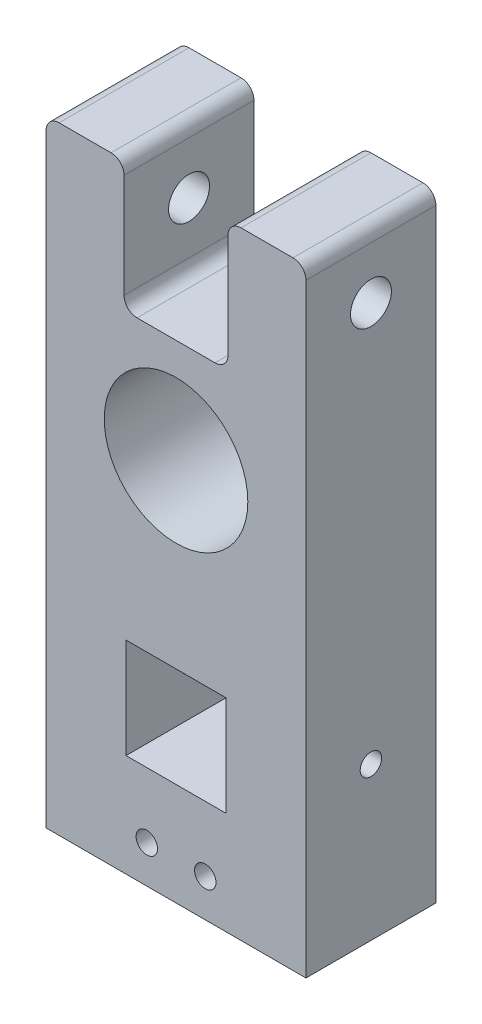
ISO-10303-21;
HEADER;
FILE_DESCRIPTION(('STEP AP214'),'2;1');
FILE_NAME('part.step','',(''),(''),'','','');
FILE_SCHEMA(('AUTOMOTIVE_DESIGN { 1 0 10303 214 1 1 1 1 }'));
ENDSEC;
DATA;
#1=APPLICATION_CONTEXT('core data for automotive mechanical design processes');
#2=APPLICATION_PROTOCOL_DEFINITION('international standard','automotive_design',2000,#1);
#3=PRODUCT_CONTEXT('',#1,'mechanical');
#4=PRODUCT('Part','Part','',(#3));
#5=PRODUCT_RELATED_PRODUCT_CATEGORY('part','',(#4));
#6=PRODUCT_DEFINITION_FORMATION('','',#4);
#7=PRODUCT_DEFINITION_CONTEXT('part definition',#1,'design');
#8=PRODUCT_DEFINITION('design','',#6,#7);
#9=PRODUCT_DEFINITION_SHAPE('','',#8);
#10=(LENGTH_UNIT() NAMED_UNIT(*) SI_UNIT(.MILLI.,.METRE.));
#11=(NAMED_UNIT(*) PLANE_ANGLE_UNIT() SI_UNIT($,.RADIAN.));
#12=(NAMED_UNIT(*) SI_UNIT($,.STERADIAN.) SOLID_ANGLE_UNIT());
#13=UNCERTAINTY_MEASURE_WITH_UNIT(LENGTH_MEASURE(1.E-05),#10,'distance_accuracy_value','');
#14=(GEOMETRIC_REPRESENTATION_CONTEXT(3) GLOBAL_UNCERTAINTY_ASSIGNED_CONTEXT((#13)) GLOBAL_UNIT_ASSIGNED_CONTEXT((#10,
#11,#12)) REPRESENTATION_CONTEXT('',''));
#15=CARTESIAN_POINT('',(0.,0.,0.));
#16=DIRECTION('',(0.,0.,1.));
#17=DIRECTION('',(1.,0.,0.));
#18=AXIS2_PLACEMENT_3D('',#15,#16,#17);
#19=CARTESIAN_POINT('',(-20.,46.55,20.));
#20=DIRECTION('',(0.,-1.,0.));
#21=DIRECTION('',(0.,0.,-1.));
#22=AXIS2_PLACEMENT_3D('',#19,#20,#21);
#23=PLANE('',#22);
#24=DIRECTION('',(-1.,0.,0.));
#25=VECTOR('',#24,1.);
#26=CARTESIAN_POINT('',(-20.,46.55,0.));
#27=LINE('',#26,#25);
#28=CARTESIAN_POINT('',(18.,46.55,0.));
#29=VERTEX_POINT('',#28);
#30=CARTESIAN_POINT('',(10.,46.55,0.));
#31=VERTEX_POINT('',#30);
#32=EDGE_CURVE('E288',#29,#31,#27,.T.);
#33=ORIENTED_EDGE('',*,*,#32,.T.);
#34=DIRECTION('',(0.,0.,1.));
#35=VECTOR('',#34,1.);
#36=CARTESIAN_POINT('',(10.,46.55,20.));
#37=LINE('',#36,#35);
#38=CARTESIAN_POINT('',(10.,46.55,20.));
#39=VERTEX_POINT('',#38);
#40=EDGE_CURVE('E321',#31,#39,#37,.T.);
#41=ORIENTED_EDGE('',*,*,#40,.T.);
#42=DIRECTION('',(-1.,0.,0.));
#43=VECTOR('',#42,1.);
#44=CARTESIAN_POINT('',(-20.,46.55,20.));
#45=LINE('',#44,#43);
#46=CARTESIAN_POINT('',(18.,46.55,20.));
#47=VERTEX_POINT('',#46);
#48=EDGE_CURVE('E271',#47,#39,#45,.T.);
#49=ORIENTED_EDGE('',*,*,#48,.F.);
#50=DIRECTION('',(0.,0.,-1.));
#51=VECTOR('',#50,1.);
#52=CARTESIAN_POINT('',(18.,46.55,20.));
#53=LINE('',#52,#51);
#54=EDGE_CURVE('E313',#47,#29,#53,.T.);
#55=ORIENTED_EDGE('',*,*,#54,.T.);
#56=EDGE_LOOP('',(#33,#41,#49,#55));
#57=FACE_BOUND('',#56,.T.);
#58=ADVANCED_FACE('F42',(#57),#23,.F.);
#59=CARTESIAN_POINT('',(0.,0.,20.));
#60=DIRECTION('',(0.,0.,-1.));
#61=DIRECTION('',(-1.,0.,0.));
#62=AXIS2_PLACEMENT_3D('',#59,#60,#61);
#63=PLANE('',#62);
#64=CARTESIAN_POINT('',(-4.50000000000001,-42.65,20.));
#65=DIRECTION('',(0.,0.,-1.));
#66=DIRECTION('',(-1.,0.,0.));
#67=AXIS2_PLACEMENT_3D('',#64,#65,#66);
#68=CIRCLE('',#67,1.65);
#69=CARTESIAN_POINT('',(-6.15000000000001,-42.65,20.));
#70=VERTEX_POINT('',#69);
#71=EDGE_CURVE('E218',#70,#70,#68,.T.);
#72=ORIENTED_EDGE('',*,*,#71,.T.);
#73=EDGE_LOOP('',(#72));
#74=FACE_BOUND('',#73,.T.);
#75=CARTESIAN_POINT('',(4.49999999999999,-42.65,20.));
#76=DIRECTION('',(0.,0.,-1.));
#77=DIRECTION('',(-1.,0.,0.));
#78=AXIS2_PLACEMENT_3D('',#75,#76,#77);
#79=CIRCLE('',#78,1.65);
#80=CARTESIAN_POINT('',(2.84999999999999,-42.65,20.));
#81=VERTEX_POINT('',#80);
#82=EDGE_CURVE('E207',#81,#81,#79,.T.);
#83=ORIENTED_EDGE('',*,*,#82,.T.);
#84=EDGE_LOOP('',(#83));
#85=FACE_BOUND('',#84,.T.);
#86=DIRECTION('',(-1.,0.,0.));
#87=VECTOR('',#86,1.);
#88=CARTESIAN_POINT('',(7.7,-32.65,20.));
#89=LINE('',#88,#87);
#90=CARTESIAN_POINT('',(7.7,-32.65,20.));
#91=VERTEX_POINT('',#90);
#92=CARTESIAN_POINT('',(-7.7,-32.65,20.));
#93=VERTEX_POINT('',#92);
#94=EDGE_CURVE('E183',#91,#93,#89,.T.);
#95=ORIENTED_EDGE('',*,*,#94,.T.);
#96=DIRECTION('',(0.,1.,0.));
#97=VECTOR('',#96,1.);
#98=CARTESIAN_POINT('',(-7.7,-32.65,20.));
#99=LINE('',#98,#97);
#100=CARTESIAN_POINT('',(-7.7,-17.25,20.));
#101=VERTEX_POINT('',#100);
#102=EDGE_CURVE('E174',#93,#101,#99,.T.);
#103=ORIENTED_EDGE('',*,*,#102,.T.);
#104=DIRECTION('',(1.,0.,0.));
#105=VECTOR('',#104,1.);
#106=CARTESIAN_POINT('',(7.7,-17.25,20.));
#107=LINE('',#106,#105);
#108=CARTESIAN_POINT('',(7.7,-17.25,20.));
#109=VERTEX_POINT('',#108);
#110=EDGE_CURVE('E189',#101,#109,#107,.T.);
#111=ORIENTED_EDGE('',*,*,#110,.T.);
#112=DIRECTION('',(0.,-1.,0.));
#113=VECTOR('',#112,1.);
#114=CARTESIAN_POINT('',(7.7,-32.65,20.));
#115=LINE('',#114,#113);
#116=EDGE_CURVE('E194',#109,#91,#115,.T.);
#117=ORIENTED_EDGE('',*,*,#116,.T.);
#118=EDGE_LOOP('',(#95,#103,#111,#117));
#119=FACE_BOUND('',#118,.T.);
#120=CARTESIAN_POINT('',(0.,10.55,20.));
#121=DIRECTION('',(0.,0.,1.));
#122=DIRECTION('',(1.,0.,0.));
#123=AXIS2_PLACEMENT_3D('',#120,#121,#122);
#124=CIRCLE('',#123,11.05);
#125=CARTESIAN_POINT('',(11.05,10.55,20.));
#126=VERTEX_POINT('',#125);
#127=EDGE_CURVE('E225',#126,#126,#124,.T.);
#128=ORIENTED_EDGE('',*,*,#127,.F.);
#129=EDGE_LOOP('',(#128));
#130=FACE_BOUND('',#129,.T.);
#131=ORIENTED_EDGE('',*,*,#48,.T.);
#132=CARTESIAN_POINT('',(10.,44.55,20.));
#133=DIRECTION('',(0.,0.,-1.));
#134=DIRECTION('',(-1.,0.,0.));
#135=AXIS2_PLACEMENT_3D('',#132,#133,#134);
#136=CIRCLE('',#135,2.);
#137=CARTESIAN_POINT('',(8.,44.55,20.));
#138=VERTEX_POINT('',#137);
#139=EDGE_CURVE('E340',#39,#138,#136,.F.);
#140=ORIENTED_EDGE('',*,*,#139,.T.);
#141=DIRECTION('',(0.,1.,0.));
#142=VECTOR('',#141,1.);
#143=CARTESIAN_POINT('',(8.,26.55,20.));
#144=LINE('',#143,#142);
#145=CARTESIAN_POINT('',(8.,28.55,20.));
#146=VERTEX_POINT('',#145);
#147=EDGE_CURVE('E232',#146,#138,#144,.T.);
#148=ORIENTED_EDGE('',*,*,#147,.F.);
#149=CARTESIAN_POINT('',(6.,28.55,20.));
#150=DIRECTION('',(0.,0.,-1.));
#151=DIRECTION('',(-1.,0.,0.));
#152=AXIS2_PLACEMENT_3D('',#149,#150,#151);
#153=CIRCLE('',#152,2.);
#154=CARTESIAN_POINT('',(6.,26.55,20.));
#155=VERTEX_POINT('',#154);
#156=EDGE_CURVE('E52',#146,#155,#153,.T.);
#157=ORIENTED_EDGE('',*,*,#156,.T.);
#158=DIRECTION('',(1.,0.,0.));
#159=VECTOR('',#158,1.);
#160=CARTESIAN_POINT('',(-8.,26.55,20.));
#161=LINE('',#160,#159);
#162=CARTESIAN_POINT('',(-6.,26.55,20.));
#163=VERTEX_POINT('',#162);
#164=EDGE_CURVE('E246',#163,#155,#161,.T.);
#165=ORIENTED_EDGE('',*,*,#164,.F.);
#166=CARTESIAN_POINT('',(-6.,28.55,20.));
#167=DIRECTION('',(0.,0.,-1.));
#168=DIRECTION('',(-1.,0.,0.));
#169=AXIS2_PLACEMENT_3D('',#166,#167,#168);
#170=CIRCLE('',#169,2.);
#171=CARTESIAN_POINT('',(-8.,28.55,20.));
#172=VERTEX_POINT('',#171);
#173=EDGE_CURVE('E383',#163,#172,#170,.T.);
#174=ORIENTED_EDGE('',*,*,#173,.T.);
#175=DIRECTION('',(0.,-1.,0.));
#176=VECTOR('',#175,1.);
#177=CARTESIAN_POINT('',(-8.,26.55,20.));
#178=LINE('',#177,#176);
#179=CARTESIAN_POINT('',(-8.,44.55,20.));
#180=VERTEX_POINT('',#179);
#181=EDGE_CURVE('E245',#180,#172,#178,.T.);
#182=ORIENTED_EDGE('',*,*,#181,.F.);
#183=CARTESIAN_POINT('',(-10.,44.55,20.));
#184=DIRECTION('',(0.,0.,-1.));
#185=DIRECTION('',(-1.,0.,0.));
#186=AXIS2_PLACEMENT_3D('',#183,#184,#185);
#187=CIRCLE('',#186,2.);
#188=CARTESIAN_POINT('',(-10.,46.55,20.));
#189=VERTEX_POINT('',#188);
#190=EDGE_CURVE('E332',#180,#189,#187,.F.);
#191=ORIENTED_EDGE('',*,*,#190,.T.);
#192=CARTESIAN_POINT('',(-18.,46.55,20.));
#193=VERTEX_POINT('',#192);
#194=EDGE_CURVE('E269',#189,#193,#45,.T.);
#195=ORIENTED_EDGE('',*,*,#194,.T.);
#196=CARTESIAN_POINT('',(-18.,44.55,20.));
#197=DIRECTION('',(0.,0.,-1.));
#198=DIRECTION('',(-1.,0.,0.));
#199=AXIS2_PLACEMENT_3D('',#196,#197,#198);
#200=CIRCLE('',#199,2.);
#201=CARTESIAN_POINT('',(-20.,44.55,20.));
#202=VERTEX_POINT('',#201);
#203=EDGE_CURVE('E331',#193,#202,#200,.F.);
#204=ORIENTED_EDGE('',*,*,#203,.T.);
#205=DIRECTION('',(0.,-1.,0.));
#206=VECTOR('',#205,1.);
#207=CARTESIAN_POINT('',(-20.,-48.45,20.));
#208=LINE('',#207,#206);
#209=CARTESIAN_POINT('',(-20.,-48.45,20.));
#210=VERTEX_POINT('',#209);
#211=EDGE_CURVE('E274',#202,#210,#208,.T.);
#212=ORIENTED_EDGE('',*,*,#211,.T.);
#213=DIRECTION('',(1.,0.,0.));
#214=VECTOR('',#213,1.);
#215=CARTESIAN_POINT('',(-20.,-48.45,20.));
#216=LINE('',#215,#214);
#217=CARTESIAN_POINT('',(20.,-48.45,20.));
#218=VERTEX_POINT('',#217);
#219=EDGE_CURVE('E280',#210,#218,#216,.T.);
#220=ORIENTED_EDGE('',*,*,#219,.T.);
#221=DIRECTION('',(0.,1.,0.));
#222=VECTOR('',#221,1.);
#223=CARTESIAN_POINT('',(20.,-48.45,20.));
#224=LINE('',#223,#222);
#225=CARTESIAN_POINT('',(20.,44.55,20.));
#226=VERTEX_POINT('',#225);
#227=EDGE_CURVE('E261',#218,#226,#224,.T.);
#228=ORIENTED_EDGE('',*,*,#227,.T.);
#229=CARTESIAN_POINT('',(18.,44.55,20.));
#230=DIRECTION('',(0.,0.,-1.));
#231=DIRECTION('',(-1.,0.,0.));
#232=AXIS2_PLACEMENT_3D('',#229,#230,#231);
#233=CIRCLE('',#232,2.);
#234=EDGE_CURVE('E330',#226,#47,#233,.F.);
#235=ORIENTED_EDGE('',*,*,#234,.T.);
#236=EDGE_LOOP('',(#131,#140,#148,#157,#165,#174,#182,#191,#195,#204,#212,#220,#228,#235));
#237=FACE_BOUND('',#236,.T.);
#238=ADVANCED_FACE('F193',(#74,#85,#119,#130,#237),#63,.F.);
#239=CARTESIAN_POINT('',(-480.,36.55,10.));
#240=DIRECTION('',(1.,0.,0.));
#241=DIRECTION('',(0.,0.,-1.));
#242=AXIS2_PLACEMENT_3D('',#239,#240,#241);
#243=CYLINDRICAL_SURFACE('',#242,3.15);
#244=CARTESIAN_POINT('',(8.00000000000001,36.55,10.));
#245=DIRECTION('',(1.,0.,0.));
#246=DIRECTION('',(0.,0.,-1.));
#247=AXIS2_PLACEMENT_3D('',#244,#245,#246);
#248=CIRCLE('',#247,3.15);
#249=CARTESIAN_POINT('',(8.00000000000001,36.55,6.85));
#250=VERTEX_POINT('',#249);
#251=EDGE_CURVE('E251',#250,#250,#248,.F.);
#252=ORIENTED_EDGE('',*,*,#251,.T.);
#253=EDGE_LOOP('',(#252));
#254=FACE_BOUND('',#253,.T.);
#255=CARTESIAN_POINT('',(20.,36.55,10.));
#256=DIRECTION('',(1.,0.,0.));
#257=DIRECTION('',(0.,0.,-1.));
#258=AXIS2_PLACEMENT_3D('',#255,#256,#257);
#259=CIRCLE('',#258,3.15);
#260=CARTESIAN_POINT('',(20.,36.55,6.85));
#261=VERTEX_POINT('',#260);
#262=EDGE_CURVE('E256',#261,#261,#259,.T.);
#263=ORIENTED_EDGE('',*,*,#262,.T.);
#264=EDGE_LOOP('',(#263));
#265=FACE_BOUND('',#264,.T.);
#266=ADVANCED_FACE('F467',(#254,#265),#243,.F.);
#267=CARTESIAN_POINT('',(20.,-48.45,20.));
#268=DIRECTION('',(-1.,0.,0.));
#269=DIRECTION('',(0.,0.,1.));
#270=AXIS2_PLACEMENT_3D('',#267,#268,#269);
#271=PLANE('',#270);
#272=CARTESIAN_POINT('',(20.,-24.95,10.));
#273=DIRECTION('',(1.,0.,0.));
#274=DIRECTION('',(0.,0.,-1.));
#275=AXIS2_PLACEMENT_3D('',#272,#273,#274);
#276=CIRCLE('',#275,1.65);
#277=CARTESIAN_POINT('',(20.,-24.95,8.35000000000001));
#278=VERTEX_POINT('',#277);
#279=EDGE_CURVE('E318',#278,#278,#276,.T.);
#280=ORIENTED_EDGE('',*,*,#279,.F.);
#281=EDGE_LOOP('',(#280));
#282=FACE_BOUND('',#281,.T.);
#283=ORIENTED_EDGE('',*,*,#262,.F.);
#284=EDGE_LOOP('',(#283));
#285=FACE_BOUND('',#284,.T.);
#286=DIRECTION('',(0.,1.,0.));
#287=VECTOR('',#286,1.);
#288=CARTESIAN_POINT('',(20.,-48.45,0.));
#289=LINE('',#288,#287);
#290=CARTESIAN_POINT('',(20.,-48.45,0.));
#291=VERTEX_POINT('',#290);
#292=CARTESIAN_POINT('',(20.,44.55,0.));
#293=VERTEX_POINT('',#292);
#294=EDGE_CURVE('E283',#291,#293,#289,.T.);
#295=ORIENTED_EDGE('',*,*,#294,.T.);
#296=DIRECTION('',(0.,0.,-1.));
#297=VECTOR('',#296,1.);
#298=CARTESIAN_POINT('',(20.,44.55,20.));
#299=LINE('',#298,#297);
#300=EDGE_CURVE('E385',#293,#226,#299,.F.);
#301=ORIENTED_EDGE('',*,*,#300,.T.);
#302=ORIENTED_EDGE('',*,*,#227,.F.);
#303=DIRECTION('',(0.,0.,-1.));
#304=VECTOR('',#303,1.);
#305=CARTESIAN_POINT('',(20.,-48.45,20.));
#306=LINE('',#305,#304);
#307=EDGE_CURVE('E278',#218,#291,#306,.T.);
#308=ORIENTED_EDGE('',*,*,#307,.T.);
#309=EDGE_LOOP('',(#295,#301,#302,#308));
#310=FACE_BOUND('',#309,.T.);
#311=ADVANCED_FACE('F422',(#282,#285,#310),#271,.F.);
#312=CARTESIAN_POINT('',(-10.,46.55,0.));
#313=VERTEX_POINT('',#312);
#314=CARTESIAN_POINT('',(-18.,46.55,0.));
#315=VERTEX_POINT('',#314);
#316=EDGE_CURVE('E281',#313,#315,#27,.T.);
#317=ORIENTED_EDGE('',*,*,#316,.T.);
#318=DIRECTION('',(0.,0.,-1.));
#319=VECTOR('',#318,1.);
#320=CARTESIAN_POINT('',(-18.,46.55,20.));
#321=LINE('',#320,#319);
#322=EDGE_CURVE('E370',#315,#193,#321,.F.);
#323=ORIENTED_EDGE('',*,*,#322,.T.);
#324=ORIENTED_EDGE('',*,*,#194,.F.);
#325=DIRECTION('',(0.,0.,-1.));
#326=VECTOR('',#325,1.);
#327=CARTESIAN_POINT('',(-10.,46.55,20.));
#328=LINE('',#327,#326);
#329=EDGE_CURVE('E361',#189,#313,#328,.T.);
#330=ORIENTED_EDGE('',*,*,#329,.T.);
#331=EDGE_LOOP('',(#317,#323,#324,#330));
#332=FACE_BOUND('',#331,.T.);
#333=ADVANCED_FACE('F441',(#332),#23,.F.);
#334=CARTESIAN_POINT('',(-20.,-48.45,20.));
#335=DIRECTION('',(1.,0.,0.));
#336=DIRECTION('',(0.,0.,-1.));
#337=AXIS2_PLACEMENT_3D('',#334,#335,#336);
#338=PLANE('',#337);
#339=CARTESIAN_POINT('',(-20.,-24.95,10.));
#340=DIRECTION('',(1.,0.,0.));
#341=DIRECTION('',(0.,0.,-1.));
#342=AXIS2_PLACEMENT_3D('',#339,#340,#341);
#343=CIRCLE('',#342,1.65);
#344=CARTESIAN_POINT('',(-20.,-24.95,8.35000000000001));
#345=VERTEX_POINT('',#344);
#346=EDGE_CURVE('E705',#345,#345,#343,.T.);
#347=ORIENTED_EDGE('',*,*,#346,.T.);
#348=EDGE_LOOP('',(#347));
#349=FACE_BOUND('',#348,.T.);
#350=CARTESIAN_POINT('',(-20.,36.55,10.));
#351=DIRECTION('',(1.,0.,0.));
#352=DIRECTION('',(0.,0.,-1.));
#353=AXIS2_PLACEMENT_3D('',#350,#351,#352);
#354=CIRCLE('',#353,3.15);
#355=CARTESIAN_POINT('',(-20.,36.55,6.85));
#356=VERTEX_POINT('',#355);
#357=EDGE_CURVE('E265',#356,#356,#354,.T.);
#358=ORIENTED_EDGE('',*,*,#357,.T.);
#359=EDGE_LOOP('',(#358));
#360=FACE_BOUND('',#359,.T.);
#361=ORIENTED_EDGE('',*,*,#211,.F.);
#362=DIRECTION('',(0.,0.,-1.));
#363=VECTOR('',#362,1.);
#364=CARTESIAN_POINT('',(-20.,44.55,20.));
#365=LINE('',#364,#363);
#366=CARTESIAN_POINT('',(-20.,44.55,0.));
#367=VERTEX_POINT('',#366);
#368=EDGE_CURVE('E360',#202,#367,#365,.T.);
#369=ORIENTED_EDGE('',*,*,#368,.T.);
#370=DIRECTION('',(0.,-1.,0.));
#371=VECTOR('',#370,1.);
#372=CARTESIAN_POINT('',(-20.,-48.45,0.));
#373=LINE('',#372,#371);
#374=CARTESIAN_POINT('',(-20.,-48.45,0.));
#375=VERTEX_POINT('',#374);
#376=EDGE_CURVE('E290',#367,#375,#373,.T.);
#377=ORIENTED_EDGE('',*,*,#376,.T.);
#378=DIRECTION('',(0.,0.,-1.));
#379=VECTOR('',#378,1.);
#380=CARTESIAN_POINT('',(-20.,-48.45,20.));
#381=LINE('',#380,#379);
#382=EDGE_CURVE('E296',#210,#375,#381,.T.);
#383=ORIENTED_EDGE('',*,*,#382,.F.);
#384=EDGE_LOOP('',(#361,#369,#377,#383));
#385=FACE_BOUND('',#384,.T.);
#386=ADVANCED_FACE('F433',(#349,#360,#385),#338,.F.);
#387=CARTESIAN_POINT('',(-20.,-48.45,20.));
#388=DIRECTION('',(0.,1.,0.));
#389=DIRECTION('',(0.,0.,1.));
#390=AXIS2_PLACEMENT_3D('',#387,#388,#389);
#391=PLANE('',#390);
#392=DIRECTION('',(1.,0.,0.));
#393=VECTOR('',#392,1.);
#394=CARTESIAN_POINT('',(-20.,-48.45,0.));
#395=LINE('',#394,#393);
#396=EDGE_CURVE('E266',#375,#291,#395,.T.);
#397=ORIENTED_EDGE('',*,*,#396,.T.);
#398=ORIENTED_EDGE('',*,*,#307,.F.);
#399=ORIENTED_EDGE('',*,*,#219,.F.);
#400=ORIENTED_EDGE('',*,*,#382,.T.);
#401=EDGE_LOOP('',(#397,#398,#399,#400));
#402=FACE_BOUND('',#401,.T.);
#403=ADVANCED_FACE('F430',(#402),#391,.F.);
#404=CARTESIAN_POINT('',(0.,0.,0.));
#405=DIRECTION('',(0.,0.,-1.));
#406=DIRECTION('',(-1.,0.,0.));
#407=AXIS2_PLACEMENT_3D('',#404,#405,#406);
#408=PLANE('',#407);
#409=CARTESIAN_POINT('',(-4.50000000000001,-42.65,0.));
#410=DIRECTION('',(0.,0.,-1.));
#411=DIRECTION('',(-1.,0.,0.));
#412=AXIS2_PLACEMENT_3D('',#409,#410,#411);
#413=CIRCLE('',#412,1.65);
#414=CARTESIAN_POINT('',(-6.15000000000001,-42.65,0.));
#415=VERTEX_POINT('',#414);
#416=EDGE_CURVE('E685',#415,#415,#413,.T.);
#417=ORIENTED_EDGE('',*,*,#416,.F.);
#418=EDGE_LOOP('',(#417));
#419=FACE_BOUND('',#418,.T.);
#420=CARTESIAN_POINT('',(4.49999999999999,-42.65,0.));
#421=DIRECTION('',(0.,0.,-1.));
#422=DIRECTION('',(-1.,0.,0.));
#423=AXIS2_PLACEMENT_3D('',#420,#421,#422);
#424=CIRCLE('',#423,1.65);
#425=CARTESIAN_POINT('',(2.84999999999999,-42.65,0.));
#426=VERTEX_POINT('',#425);
#427=EDGE_CURVE('E686',#426,#426,#424,.T.);
#428=ORIENTED_EDGE('',*,*,#427,.F.);
#429=EDGE_LOOP('',(#428));
#430=FACE_BOUND('',#429,.T.);
#431=DIRECTION('',(0.,1.,0.));
#432=VECTOR('',#431,1.);
#433=CARTESIAN_POINT('',(-7.7,-32.65,0.));
#434=LINE('',#433,#432);
#435=CARTESIAN_POINT('',(-7.7,-32.65,0.));
#436=VERTEX_POINT('',#435);
#437=CARTESIAN_POINT('',(-7.7,-17.25,0.));
#438=VERTEX_POINT('',#437);
#439=EDGE_CURVE('E178',#436,#438,#434,.T.);
#440=ORIENTED_EDGE('',*,*,#439,.F.);
#441=DIRECTION('',(-1.,0.,0.));
#442=VECTOR('',#441,1.);
#443=CARTESIAN_POINT('',(7.7,-32.65,0.));
#444=LINE('',#443,#442);
#445=CARTESIAN_POINT('',(7.7,-32.65,0.));
#446=VERTEX_POINT('',#445);
#447=EDGE_CURVE('E196',#446,#436,#444,.T.);
#448=ORIENTED_EDGE('',*,*,#447,.F.);
#449=DIRECTION('',(0.,-1.,0.));
#450=VECTOR('',#449,1.);
#451=CARTESIAN_POINT('',(7.7,-32.65,0.));
#452=LINE('',#451,#450);
#453=CARTESIAN_POINT('',(7.7,-17.25,0.));
#454=VERTEX_POINT('',#453);
#455=EDGE_CURVE('E204',#454,#446,#452,.T.);
#456=ORIENTED_EDGE('',*,*,#455,.F.);
#457=DIRECTION('',(1.,0.,0.));
#458=VECTOR('',#457,1.);
#459=CARTESIAN_POINT('',(7.7,-17.25,0.));
#460=LINE('',#459,#458);
#461=EDGE_CURVE('E213',#438,#454,#460,.T.);
#462=ORIENTED_EDGE('',*,*,#461,.F.);
#463=EDGE_LOOP('',(#440,#448,#456,#462));
#464=FACE_BOUND('',#463,.T.);
#465=CARTESIAN_POINT('',(0.,10.55,0.));
#466=DIRECTION('',(0.,0.,1.));
#467=DIRECTION('',(1.,0.,0.));
#468=AXIS2_PLACEMENT_3D('',#465,#466,#467);
#469=CIRCLE('',#468,11.05);
#470=CARTESIAN_POINT('',(11.05,10.55,0.));
#471=VERTEX_POINT('',#470);
#472=EDGE_CURVE('E233',#471,#471,#469,.T.);
#473=ORIENTED_EDGE('',*,*,#472,.T.);
#474=EDGE_LOOP('',(#473));
#475=FACE_BOUND('',#474,.T.);
#476=DIRECTION('',(0.,-1.,0.));
#477=VECTOR('',#476,1.);
#478=CARTESIAN_POINT('',(8.,0.,0.));
#479=LINE('',#478,#477);
#480=CARTESIAN_POINT('',(8.,44.55,0.));
#481=VERTEX_POINT('',#480);
#482=CARTESIAN_POINT('',(8.,28.55,0.));
#483=VERTEX_POINT('',#482);
#484=EDGE_CURVE('E253',#481,#483,#479,.T.);
#485=ORIENTED_EDGE('',*,*,#484,.F.);
#486=CARTESIAN_POINT('',(10.,44.55,0.));
#487=DIRECTION('',(0.,0.,-1.));
#488=DIRECTION('',(-1.,0.,0.));
#489=AXIS2_PLACEMENT_3D('',#486,#487,#488);
#490=CIRCLE('',#489,2.);
#491=EDGE_CURVE('E358',#481,#31,#490,.T.);
#492=ORIENTED_EDGE('',*,*,#491,.T.);
#493=ORIENTED_EDGE('',*,*,#32,.F.);
#494=CARTESIAN_POINT('',(18.,44.55,0.));
#495=DIRECTION('',(0.,0.,-1.));
#496=DIRECTION('',(-1.,0.,0.));
#497=AXIS2_PLACEMENT_3D('',#494,#495,#496);
#498=CIRCLE('',#497,2.);
#499=EDGE_CURVE('E349',#29,#293,#498,.T.);
#500=ORIENTED_EDGE('',*,*,#499,.T.);
#501=ORIENTED_EDGE('',*,*,#294,.F.);
#502=ORIENTED_EDGE('',*,*,#396,.F.);
#503=ORIENTED_EDGE('',*,*,#376,.F.);
#504=CARTESIAN_POINT('',(-18.,44.55,0.));
#505=DIRECTION('',(0.,0.,-1.));
#506=DIRECTION('',(-1.,0.,0.));
#507=AXIS2_PLACEMENT_3D('',#504,#505,#506);
#508=CIRCLE('',#507,2.);
#509=EDGE_CURVE('E354',#367,#315,#508,.T.);
#510=ORIENTED_EDGE('',*,*,#509,.T.);
#511=ORIENTED_EDGE('',*,*,#316,.F.);
#512=CARTESIAN_POINT('',(-10.,44.55,0.));
#513=DIRECTION('',(0.,0.,-1.));
#514=DIRECTION('',(-1.,0.,0.));
#515=AXIS2_PLACEMENT_3D('',#512,#513,#514);
#516=CIRCLE('',#515,2.);
#517=CARTESIAN_POINT('',(-8.,44.55,0.));
#518=VERTEX_POINT('',#517);
#519=EDGE_CURVE('E346',#313,#518,#516,.T.);
#520=ORIENTED_EDGE('',*,*,#519,.T.);
#521=DIRECTION('',(0.,1.,0.));
#522=VECTOR('',#521,1.);
#523=CARTESIAN_POINT('',(-8.,0.,0.));
#524=LINE('',#523,#522);
#525=CARTESIAN_POINT('',(-8.,28.55,0.));
#526=VERTEX_POINT('',#525);
#527=EDGE_CURVE('E249',#526,#518,#524,.T.);
#528=ORIENTED_EDGE('',*,*,#527,.F.);
#529=CARTESIAN_POINT('',(-6.,28.55,0.));
#530=DIRECTION('',(0.,0.,-1.));
#531=DIRECTION('',(-1.,0.,0.));
#532=AXIS2_PLACEMENT_3D('',#529,#530,#531);
#533=CIRCLE('',#532,2.);
#534=CARTESIAN_POINT('',(-6.,26.55,0.));
#535=VERTEX_POINT('',#534);
#536=EDGE_CURVE('E58',#526,#535,#533,.F.);
#537=ORIENTED_EDGE('',*,*,#536,.T.);
#538=DIRECTION('',(-1.,0.,0.));
#539=VECTOR('',#538,1.);
#540=CARTESIAN_POINT('',(0.,26.55,0.));
#541=LINE('',#540,#539);
#542=CARTESIAN_POINT('',(6.,26.55,0.));
#543=VERTEX_POINT('',#542);
#544=EDGE_CURVE('E305',#543,#535,#541,.T.);
#545=ORIENTED_EDGE('',*,*,#544,.F.);
#546=CARTESIAN_POINT('',(6.,28.55,0.));
#547=DIRECTION('',(0.,0.,-1.));
#548=DIRECTION('',(-1.,0.,0.));
#549=AXIS2_PLACEMENT_3D('',#546,#547,#548);
#550=CIRCLE('',#549,2.);
#551=EDGE_CURVE('E11',#543,#483,#550,.F.);
#552=ORIENTED_EDGE('',*,*,#551,.T.);
#553=EDGE_LOOP('',(#485,#492,#493,#500,#501,#502,#503,#510,#511,#520,#528,#537,#545,#552));
#554=FACE_BOUND('',#553,.T.);
#555=ADVANCED_FACE('F402',(#419,#430,#464,#475,#554),#408,.T.);
#556=CARTESIAN_POINT('',(-8.00000000000001,36.55,10.));
#557=DIRECTION('',(-1.,0.,0.));
#558=DIRECTION('',(0.,0.,1.));
#559=AXIS2_PLACEMENT_3D('',#556,#557,#558);
#560=CIRCLE('',#559,3.15);
#561=CARTESIAN_POINT('',(-8.00000000000001,36.55,13.15));
#562=VERTEX_POINT('',#561);
#563=EDGE_CURVE('E248',#562,#562,#560,.F.);
#564=ORIENTED_EDGE('',*,*,#563,.T.);
#565=EDGE_LOOP('',(#564));
#566=FACE_BOUND('',#565,.T.);
#567=ORIENTED_EDGE('',*,*,#357,.F.);
#568=EDGE_LOOP('',(#567));
#569=FACE_BOUND('',#568,.T.);
#570=ADVANCED_FACE('F484',(#566,#569),#243,.F.);
#571=CARTESIAN_POINT('',(8.,26.55,-480.));
#572=DIRECTION('',(1.,0.,0.));
#573=DIRECTION('',(0.,0.,-1.));
#574=AXIS2_PLACEMENT_3D('',#571,#572,#573);
#575=PLANE('',#574);
#576=ORIENTED_EDGE('',*,*,#251,.F.);
#577=EDGE_LOOP('',(#576));
#578=FACE_BOUND('',#577,.T.);
#579=ORIENTED_EDGE('',*,*,#147,.T.);
#580=DIRECTION('',(0.,0.,1.));
#581=VECTOR('',#580,1.);
#582=CARTESIAN_POINT('',(8.,44.55,-480.));
#583=LINE('',#582,#581);
#584=EDGE_CURVE('E341',#138,#481,#583,.F.);
#585=ORIENTED_EDGE('',*,*,#584,.T.);
#586=ORIENTED_EDGE('',*,*,#484,.T.);
#587=DIRECTION('',(0.,0.,1.));
#588=VECTOR('',#587,1.);
#589=CARTESIAN_POINT('',(8.,28.55,20.));
#590=LINE('',#589,#588);
#591=EDGE_CURVE('E338',#483,#146,#590,.T.);
#592=ORIENTED_EDGE('',*,*,#591,.T.);
#593=EDGE_LOOP('',(#579,#585,#586,#592));
#594=FACE_BOUND('',#593,.T.);
#595=ADVANCED_FACE('F404',(#578,#594),#575,.F.);
#596=CARTESIAN_POINT('',(-8.,26.55,-480.));
#597=DIRECTION('',(-1.,0.,0.));
#598=DIRECTION('',(0.,0.,1.));
#599=AXIS2_PLACEMENT_3D('',#596,#597,#598);
#600=PLANE('',#599);
#601=ORIENTED_EDGE('',*,*,#563,.F.);
#602=EDGE_LOOP('',(#601));
#603=FACE_BOUND('',#602,.T.);
#604=ORIENTED_EDGE('',*,*,#527,.T.);
#605=DIRECTION('',(0.,0.,-1.));
#606=VECTOR('',#605,1.);
#607=CARTESIAN_POINT('',(-8.,44.55,-480.));
#608=LINE('',#607,#606);
#609=EDGE_CURVE('E373',#518,#180,#608,.F.);
#610=ORIENTED_EDGE('',*,*,#609,.T.);
#611=ORIENTED_EDGE('',*,*,#181,.T.);
#612=DIRECTION('',(0.,0.,1.));
#613=VECTOR('',#612,1.);
#614=CARTESIAN_POINT('',(-8.,28.55,0.));
#615=LINE('',#614,#613);
#616=EDGE_CURVE('E369',#172,#526,#615,.F.);
#617=ORIENTED_EDGE('',*,*,#616,.T.);
#618=EDGE_LOOP('',(#604,#610,#611,#617));
#619=FACE_BOUND('',#618,.T.);
#620=ADVANCED_FACE('F446',(#603,#619),#600,.F.);
#621=CARTESIAN_POINT('',(-8.,26.55,-480.));
#622=DIRECTION('',(0.,-1.,0.));
#623=DIRECTION('',(0.,0.,-1.));
#624=AXIS2_PLACEMENT_3D('',#621,#622,#623);
#625=PLANE('',#624);
#626=ORIENTED_EDGE('',*,*,#544,.T.);
#627=DIRECTION('',(0.,0.,1.));
#628=VECTOR('',#627,1.);
#629=CARTESIAN_POINT('',(-6.,26.55,20.));
#630=LINE('',#629,#628);
#631=EDGE_CURVE('E377',#535,#163,#630,.T.);
#632=ORIENTED_EDGE('',*,*,#631,.T.);
#633=ORIENTED_EDGE('',*,*,#164,.T.);
#634=DIRECTION('',(0.,0.,1.));
#635=VECTOR('',#634,1.);
#636=CARTESIAN_POINT('',(6.,26.55,0.));
#637=LINE('',#636,#635);
#638=EDGE_CURVE('E69',#155,#543,#637,.F.);
#639=ORIENTED_EDGE('',*,*,#638,.T.);
#640=EDGE_LOOP('',(#626,#632,#633,#639));
#641=FACE_BOUND('',#640,.T.);
#642=ADVANCED_FACE('F397',(#641),#625,.F.);
#643=CARTESIAN_POINT('',(0.,10.55,0.));
#644=DIRECTION('',(0.,0.,1.));
#645=DIRECTION('',(1.,0.,0.));
#646=AXIS2_PLACEMENT_3D('',#643,#644,#645);
#647=CYLINDRICAL_SURFACE('',#646,11.05);
#648=ORIENTED_EDGE('',*,*,#472,.F.);
#649=EDGE_LOOP('',(#648));
#650=FACE_BOUND('',#649,.T.);
#651=ORIENTED_EDGE('',*,*,#127,.T.);
#652=EDGE_LOOP('',(#651));
#653=FACE_BOUND('',#652,.T.);
#654=ADVANCED_FACE('F588',(#650,#653),#647,.F.);
#655=CARTESIAN_POINT('',(-7.7,-32.65,20.));
#656=DIRECTION('',(-1.,0.,0.));
#657=DIRECTION('',(0.,0.,1.));
#658=AXIS2_PLACEMENT_3D('',#655,#656,#657);
#659=PLANE('',#658);
#660=CARTESIAN_POINT('',(-7.70000000000001,-24.95,10.));
#661=DIRECTION('',(-1.,0.,0.));
#662=DIRECTION('',(0.,0.,1.));
#663=AXIS2_PLACEMENT_3D('',#660,#661,#662);
#664=CIRCLE('',#663,1.65);
#665=CARTESIAN_POINT('',(-7.70000000000001,-24.95,11.65));
#666=VERTEX_POINT('',#665);
#667=EDGE_CURVE('E316',#666,#666,#664,.T.);
#668=ORIENTED_EDGE('',*,*,#667,.T.);
#669=EDGE_LOOP('',(#668));
#670=FACE_BOUND('',#669,.T.);
#671=ORIENTED_EDGE('',*,*,#439,.T.);
#672=DIRECTION('',(0.,0.,-1.));
#673=VECTOR('',#672,1.);
#674=CARTESIAN_POINT('',(-7.7,-17.25,20.));
#675=LINE('',#674,#673);
#676=EDGE_CURVE('E171',#101,#438,#675,.T.);
#677=ORIENTED_EDGE('',*,*,#676,.F.);
#678=ORIENTED_EDGE('',*,*,#102,.F.);
#679=DIRECTION('',(0.,0.,-1.));
#680=VECTOR('',#679,1.);
#681=CARTESIAN_POINT('',(-7.7,-32.65,20.));
#682=LINE('',#681,#680);
#683=EDGE_CURVE('E222',#93,#436,#682,.T.);
#684=ORIENTED_EDGE('',*,*,#683,.T.);
#685=EDGE_LOOP('',(#671,#677,#678,#684));
#686=FACE_BOUND('',#685,.T.);
#687=ADVANCED_FACE('F173',(#670,#686),#659,.F.);
#688=CARTESIAN_POINT('',(7.7,-32.65,20.));
#689=DIRECTION('',(0.,-1.,0.));
#690=DIRECTION('',(0.,0.,-1.));
#691=AXIS2_PLACEMENT_3D('',#688,#689,#690);
#692=PLANE('',#691);
#693=ORIENTED_EDGE('',*,*,#447,.T.);
#694=ORIENTED_EDGE('',*,*,#683,.F.);
#695=ORIENTED_EDGE('',*,*,#94,.F.);
#696=DIRECTION('',(0.,0.,-1.));
#697=VECTOR('',#696,1.);
#698=CARTESIAN_POINT('',(7.7,-32.65,20.));
#699=LINE('',#698,#697);
#700=EDGE_CURVE('E228',#91,#446,#699,.T.);
#701=ORIENTED_EDGE('',*,*,#700,.T.);
#702=EDGE_LOOP('',(#693,#694,#695,#701));
#703=FACE_BOUND('',#702,.T.);
#704=ADVANCED_FACE('F572',(#703),#692,.F.);
#705=CARTESIAN_POINT('',(7.7,-32.65,20.));
#706=DIRECTION('',(1.,0.,0.));
#707=DIRECTION('',(0.,0.,-1.));
#708=AXIS2_PLACEMENT_3D('',#705,#706,#707);
#709=PLANE('',#708);
#710=CARTESIAN_POINT('',(7.69999999999999,-24.95,10.));
#711=DIRECTION('',(1.,0.,0.));
#712=DIRECTION('',(0.,0.,-1.));
#713=AXIS2_PLACEMENT_3D('',#710,#711,#712);
#714=CIRCLE('',#713,1.65);
#715=CARTESIAN_POINT('',(7.69999999999999,-24.95,8.35000000000001));
#716=VERTEX_POINT('',#715);
#717=EDGE_CURVE('E314',#716,#716,#714,.T.);
#718=ORIENTED_EDGE('',*,*,#717,.T.);
#719=EDGE_LOOP('',(#718));
#720=FACE_BOUND('',#719,.T.);
#721=ORIENTED_EDGE('',*,*,#455,.T.);
#722=ORIENTED_EDGE('',*,*,#700,.F.);
#723=ORIENTED_EDGE('',*,*,#116,.F.);
#724=DIRECTION('',(0.,0.,-1.));
#725=VECTOR('',#724,1.);
#726=CARTESIAN_POINT('',(7.7,-17.25,20.));
#727=LINE('',#726,#725);
#728=EDGE_CURVE('E182',#109,#454,#727,.T.);
#729=ORIENTED_EDGE('',*,*,#728,.T.);
#730=EDGE_LOOP('',(#721,#722,#723,#729));
#731=FACE_BOUND('',#730,.T.);
#732=ADVANCED_FACE('F564',(#720,#731),#709,.F.);
#733=CARTESIAN_POINT('',(7.7,-17.25,20.));
#734=DIRECTION('',(0.,1.,0.));
#735=DIRECTION('',(0.,0.,1.));
#736=AXIS2_PLACEMENT_3D('',#733,#734,#735);
#737=PLANE('',#736);
#738=ORIENTED_EDGE('',*,*,#461,.T.);
#739=ORIENTED_EDGE('',*,*,#728,.F.);
#740=ORIENTED_EDGE('',*,*,#110,.F.);
#741=ORIENTED_EDGE('',*,*,#676,.T.);
#742=EDGE_LOOP('',(#738,#739,#740,#741));
#743=FACE_BOUND('',#742,.T.);
#744=ADVANCED_FACE('F186',(#743),#737,.F.);
#745=CARTESIAN_POINT('',(4.49999999999999,-42.65,20.));
#746=DIRECTION('',(0.,0.,-1.));
#747=DIRECTION('',(-1.,0.,0.));
#748=AXIS2_PLACEMENT_3D('',#745,#746,#747);
#749=CYLINDRICAL_SURFACE('',#748,1.65);
#750=ORIENTED_EDGE('',*,*,#82,.F.);
#751=EDGE_LOOP('',(#750));
#752=FACE_BOUND('',#751,.T.);
#753=ORIENTED_EDGE('',*,*,#427,.T.);
#754=EDGE_LOOP('',(#753));
#755=FACE_BOUND('',#754,.T.);
#756=ADVANCED_FACE('F549',(#752,#755),#749,.F.);
#757=CARTESIAN_POINT('',(-4.50000000000001,-42.65,20.));
#758=DIRECTION('',(0.,0.,-1.));
#759=DIRECTION('',(-1.,0.,0.));
#760=AXIS2_PLACEMENT_3D('',#757,#758,#759);
#761=CYLINDRICAL_SURFACE('',#760,1.65);
#762=ORIENTED_EDGE('',*,*,#71,.F.);
#763=EDGE_LOOP('',(#762));
#764=FACE_BOUND('',#763,.T.);
#765=ORIENTED_EDGE('',*,*,#416,.T.);
#766=EDGE_LOOP('',(#765));
#767=FACE_BOUND('',#766,.T.);
#768=ADVANCED_FACE('F538',(#764,#767),#761,.F.);
#769=CARTESIAN_POINT('',(-30.,-24.95,10.));
#770=DIRECTION('',(1.,0.,0.));
#771=DIRECTION('',(0.,0.,-1.));
#772=AXIS2_PLACEMENT_3D('',#769,#770,#771);
#773=CYLINDRICAL_SURFACE('',#772,1.65);
#774=ORIENTED_EDGE('',*,*,#279,.T.);
#775=EDGE_LOOP('',(#774));
#776=FACE_BOUND('',#775,.T.);
#777=ORIENTED_EDGE('',*,*,#717,.F.);
#778=EDGE_LOOP('',(#777));
#779=FACE_BOUND('',#778,.T.);
#780=ADVANCED_FACE('F532',(#776,#779),#773,.F.);
#781=ORIENTED_EDGE('',*,*,#667,.F.);
#782=EDGE_LOOP('',(#781));
#783=FACE_BOUND('',#782,.T.);
#784=ORIENTED_EDGE('',*,*,#346,.F.);
#785=EDGE_LOOP('',(#784));
#786=FACE_BOUND('',#785,.T.);
#787=ADVANCED_FACE('F490',(#783,#786),#773,.F.);
#788=CARTESIAN_POINT('',(10.,44.55,20.));
#789=DIRECTION('',(0.,0.,1.));
#790=DIRECTION('',(1.,0.,0.));
#791=AXIS2_PLACEMENT_3D('',#788,#789,#790);
#792=CYLINDRICAL_SURFACE('',#791,2.);
#793=ORIENTED_EDGE('',*,*,#491,.F.);
#794=ORIENTED_EDGE('',*,*,#584,.F.);
#795=ORIENTED_EDGE('',*,*,#139,.F.);
#796=ORIENTED_EDGE('',*,*,#40,.F.);
#797=EDGE_LOOP('',(#793,#794,#795,#796));
#798=FACE_BOUND('',#797,.T.);
#799=ADVANCED_FACE('F410',(#798),#792,.T.);
#800=CARTESIAN_POINT('',(-18.,44.55,20.));
#801=DIRECTION('',(0.,0.,-1.));
#802=DIRECTION('',(-1.,0.,0.));
#803=AXIS2_PLACEMENT_3D('',#800,#801,#802);
#804=CYLINDRICAL_SURFACE('',#803,2.);
#805=ORIENTED_EDGE('',*,*,#203,.F.);
#806=ORIENTED_EDGE('',*,*,#322,.F.);
#807=ORIENTED_EDGE('',*,*,#509,.F.);
#808=ORIENTED_EDGE('',*,*,#368,.F.);
#809=EDGE_LOOP('',(#805,#806,#807,#808));
#810=FACE_BOUND('',#809,.T.);
#811=ADVANCED_FACE('F440',(#810),#804,.T.);
#812=CARTESIAN_POINT('',(-10.,44.55,20.));
#813=DIRECTION('',(0.,0.,-1.));
#814=DIRECTION('',(-1.,0.,0.));
#815=AXIS2_PLACEMENT_3D('',#812,#813,#814);
#816=CYLINDRICAL_SURFACE('',#815,2.);
#817=ORIENTED_EDGE('',*,*,#190,.F.);
#818=ORIENTED_EDGE('',*,*,#609,.F.);
#819=ORIENTED_EDGE('',*,*,#519,.F.);
#820=ORIENTED_EDGE('',*,*,#329,.F.);
#821=EDGE_LOOP('',(#817,#818,#819,#820));
#822=FACE_BOUND('',#821,.T.);
#823=ADVANCED_FACE('F450',(#822),#816,.T.);
#824=CARTESIAN_POINT('',(-6.,28.55,-480.));
#825=DIRECTION('',(0.,0.,-1.));
#826=DIRECTION('',(-1.,0.,0.));
#827=AXIS2_PLACEMENT_3D('',#824,#825,#826);
#828=CYLINDRICAL_SURFACE('',#827,2.);
#829=ORIENTED_EDGE('',*,*,#536,.F.);
#830=ORIENTED_EDGE('',*,*,#616,.F.);
#831=ORIENTED_EDGE('',*,*,#173,.F.);
#832=ORIENTED_EDGE('',*,*,#631,.F.);
#833=EDGE_LOOP('',(#829,#830,#831,#832));
#834=FACE_BOUND('',#833,.T.);
#835=ADVANCED_FACE('F455',(#834),#828,.F.);
#836=CARTESIAN_POINT('',(6.,28.55,-480.));
#837=DIRECTION('',(0.,0.,-1.));
#838=DIRECTION('',(-1.,0.,0.));
#839=AXIS2_PLACEMENT_3D('',#836,#837,#838);
#840=CYLINDRICAL_SURFACE('',#839,2.);
#841=ORIENTED_EDGE('',*,*,#551,.F.);
#842=ORIENTED_EDGE('',*,*,#638,.F.);
#843=ORIENTED_EDGE('',*,*,#156,.F.);
#844=ORIENTED_EDGE('',*,*,#591,.F.);
#845=EDGE_LOOP('',(#841,#842,#843,#844));
#846=FACE_BOUND('',#845,.T.);
#847=ADVANCED_FACE('F396',(#846),#840,.F.);
#848=CARTESIAN_POINT('',(18.,44.55,20.));
#849=DIRECTION('',(0.,0.,-1.));
#850=DIRECTION('',(-1.,0.,0.));
#851=AXIS2_PLACEMENT_3D('',#848,#849,#850);
#852=CYLINDRICAL_SURFACE('',#851,2.);
#853=ORIENTED_EDGE('',*,*,#234,.F.);
#854=ORIENTED_EDGE('',*,*,#300,.F.);
#855=ORIENTED_EDGE('',*,*,#499,.F.);
#856=ORIENTED_EDGE('',*,*,#54,.F.);
#857=EDGE_LOOP('',(#853,#854,#855,#856));
#858=FACE_BOUND('',#857,.T.);
#859=ADVANCED_FACE('F46',(#858),#852,.T.);
#860=CLOSED_SHELL('',(#58,#238,#266,#311,#333,#386,#403,#555,#570,#595,#620,#642,#654,#687,#704,
#732,#744,#756,#768,#780,#787,#799,#811,#823,#835,#847,#859));
#861=MANIFOLD_SOLID_BREP('B2',#860);
#862=ADVANCED_BREP_SHAPE_REPRESENTATION('',(#18,#861),#14);
#863=SHAPE_DEFINITION_REPRESENTATION(#9,#862);
ENDSEC;
END-ISO-10303-21;
